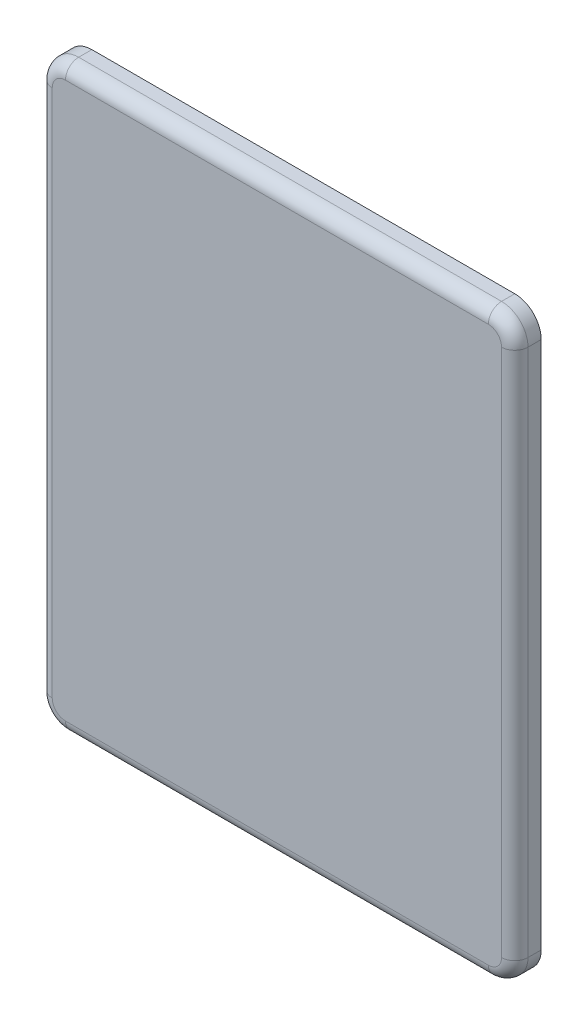
ISO-10303-21;
HEADER;
FILE_DESCRIPTION(('STEP AP214'),'2;1');
FILE_NAME('part.step','',(''),(''),'','','');
FILE_SCHEMA(('AUTOMOTIVE_DESIGN { 1 0 10303 214 1 1 1 1 }'));
ENDSEC;
DATA;
#1=APPLICATION_CONTEXT('core data for automotive mechanical design processes');
#2=APPLICATION_PROTOCOL_DEFINITION('international standard','automotive_design',2000,#1);
#3=PRODUCT_CONTEXT('',#1,'mechanical');
#4=PRODUCT('Part','Part','',(#3));
#5=PRODUCT_RELATED_PRODUCT_CATEGORY('part','',(#4));
#6=PRODUCT_DEFINITION_FORMATION('','',#4);
#7=PRODUCT_DEFINITION_CONTEXT('part definition',#1,'design');
#8=PRODUCT_DEFINITION('design','',#6,#7);
#9=PRODUCT_DEFINITION_SHAPE('','',#8);
#10=(LENGTH_UNIT() NAMED_UNIT(*) SI_UNIT(.MILLI.,.METRE.));
#11=(NAMED_UNIT(*) PLANE_ANGLE_UNIT() SI_UNIT($,.RADIAN.));
#12=(NAMED_UNIT(*) SI_UNIT($,.STERADIAN.) SOLID_ANGLE_UNIT());
#13=UNCERTAINTY_MEASURE_WITH_UNIT(LENGTH_MEASURE(1.E-05),#10,'distance_accuracy_value','');
#14=(GEOMETRIC_REPRESENTATION_CONTEXT(3) GLOBAL_UNCERTAINTY_ASSIGNED_CONTEXT((#13)) GLOBAL_UNIT_ASSIGNED_CONTEXT((#10,
#11,#12)) REPRESENTATION_CONTEXT('',''));
#15=CARTESIAN_POINT('',(0.,0.,0.));
#16=DIRECTION('',(0.,0.,1.));
#17=DIRECTION('',(1.,0.,0.));
#18=AXIS2_PLACEMENT_3D('',#15,#16,#17);
#19=CARTESIAN_POINT('',(13.49999934,11.49999934,0.5));
#20=DIRECTION('',(0.,0.,1.));
#21=DIRECTION('',(1.,0.,0.));
#22=AXIS2_PLACEMENT_3D('',#19,#20,#21);
#23=PLANE('',#22);
#24=CARTESIAN_POINT('',(13.899999361847,10.999999357519,0.5));
#25=DIRECTION('',(0.,0.,1.));
#26=DIRECTION('',(1.,0.,0.));
#27=AXIS2_PLACEMENT_3D('',#24,#25,#26);
#28=CIRCLE('',#27,0.0250000000000042);
#29=CARTESIAN_POINT('',(13.8999993629399,10.974999357519,0.5));
#30=VERTEX_POINT('',#29);
#31=CARTESIAN_POINT('',(13.9249993618472,10.9999993586119,0.5));
#32=VERTEX_POINT('',#31);
#33=EDGE_CURVE('E112',#30,#32,#28,.T.);
#34=ORIENTED_EDGE('',*,*,#33,.T.);
#35=DIRECTION('',(-4.371138828674E-08,0.999999999999999,0.));
#36=VECTOR('',#35,1.);
#37=CARTESIAN_POINT('',(13.9249993509195,11.249999358595,0.5));
#38=LINE('',#37,#36);
#39=CARTESIAN_POINT('',(13.924999318136,11.9999993585419,0.5));
#40=VERTEX_POINT('',#39);
#41=EDGE_CURVE('E128',#40,#32,#38,.F.);
#42=ORIENTED_EDGE('',*,*,#41,.F.);
#43=CARTESIAN_POINT('',(13.899999318135,11.999999357449,0.5));
#44=DIRECTION('',(0.,0.,1.));
#45=DIRECTION('',(1.,0.,0.));
#46=AXIS2_PLACEMENT_3D('',#43,#44,#45);
#47=CIRCLE('',#46,0.0250000000010017);
#48=CARTESIAN_POINT('',(13.8999993170426,12.0249993574501,0.5));
#49=VERTEX_POINT('',#48);
#50=EDGE_CURVE('E147',#40,#49,#47,.T.);
#51=ORIENTED_EDGE('',*,*,#50,.T.);
#52=DIRECTION('',(-0.999999999999999,-4.371138828674E-08,0.));
#53=VECTOR('',#52,1.);
#54=CARTESIAN_POINT('',(13.699999317047,12.0249993487078,0.5));
#55=LINE('',#54,#53);
#56=CARTESIAN_POINT('',(13.0999993170601,12.024999322481,0.5));
#57=VERTEX_POINT('',#56);
#58=EDGE_CURVE('E124',#57,#49,#55,.F.);
#59=ORIENTED_EDGE('',*,*,#58,.F.);
#60=CARTESIAN_POINT('',(13.099999318153,11.999999322481,0.5));
#61=DIRECTION('',(0.,0.,1.));
#62=DIRECTION('',(1.,0.,0.));
#63=AXIS2_PLACEMENT_3D('',#60,#61,#62);
#64=CIRCLE('',#63,0.0250000000000007);
#65=CARTESIAN_POINT('',(13.0749993181528,11.9999993213881,0.5));
#66=VERTEX_POINT('',#65);
#67=EDGE_CURVE('E143',#57,#66,#64,.T.);
#68=ORIENTED_EDGE('',*,*,#67,.T.);
#69=DIRECTION('',(4.371138821735E-08,-0.999999999999999,0.));
#70=VECTOR('',#69,1.);
#71=CARTESIAN_POINT('',(13.0749993290805,11.749999321405,0.5));
#72=LINE('',#71,#70);
#73=CARTESIAN_POINT('',(13.074999361864,10.9999993214581,0.5));
#74=VERTEX_POINT('',#73);
#75=EDGE_CURVE('E84',#74,#66,#72,.F.);
#76=ORIENTED_EDGE('',*,*,#75,.F.);
#77=CARTESIAN_POINT('',(13.099999361865,10.999999322551,0.5));
#78=DIRECTION('',(0.,0.,1.));
#79=DIRECTION('',(1.,0.,0.));
#80=AXIS2_PLACEMENT_3D('',#77,#78,#79);
#81=CIRCLE('',#80,0.0250000000009999);
#82=CARTESIAN_POINT('',(13.0999993629574,10.9749993225499,0.5));
#83=VERTEX_POINT('',#82);
#84=EDGE_CURVE('E21',#74,#83,#81,.T.);
#85=ORIENTED_EDGE('',*,*,#84,.T.);
#86=DIRECTION('',(0.999999999999999,4.371138828674E-08,0.));
#87=VECTOR('',#86,1.);
#88=CARTESIAN_POINT('',(13.299999362953,10.9749993312922,0.5));
#89=LINE('',#88,#87);
#90=EDGE_CURVE('E90',#30,#83,#89,.F.);
#91=ORIENTED_EDGE('',*,*,#90,.F.);
#92=EDGE_LOOP('',(#34,#42,#51,#59,#68,#76,#85,#91));
#93=FACE_BOUND('',#92,.T.);
#94=ADVANCED_FACE('F17',(#93),#23,.T.);
#95=CARTESIAN_POINT('',(13.074999329081,11.749999321405,0.475));
#96=DIRECTION('',(4.371138821735E-08,-0.999999999999999,0.));
#97=DIRECTION('',(0.999999999999999,4.371138821735E-08,0.));
#98=AXIS2_PLACEMENT_3D('',#95,#96,#97);
#99=CYLINDRICAL_SURFACE('',#98,0.025);
#100=CARTESIAN_POINT('',(13.074999318153,11.999999321388,0.474999999999998));
#101=DIRECTION('',(4.37200275982281E-08,-0.999999999999999,0.));
#102=DIRECTION('',(-0.999999999999999,-4.37200275982251E-08,0.));
#103=AXIS2_PLACEMENT_3D('',#100,#101,#102);
#104=CIRCLE('',#103,0.025000000000002);
#105=CARTESIAN_POINT('',(13.049999318153,11.999999320295,0.475));
#106=VERTEX_POINT('',#105);
#107=EDGE_CURVE('E145',#66,#106,#104,.T.);
#108=ORIENTED_EDGE('',*,*,#107,.T.);
#109=DIRECTION('',(4.371138821735E-08,-0.999999999999999,0.));
#110=VECTOR('',#109,1.);
#111=CARTESIAN_POINT('',(13.049999318153,11.999999320295,0.475));
#112=LINE('',#111,#110);
#113=CARTESIAN_POINT('',(13.0499993618641,10.999999320365,0.475));
#114=VERTEX_POINT('',#113);
#115=EDGE_CURVE('E177',#114,#106,#112,.F.);
#116=ORIENTED_EDGE('',*,*,#115,.F.);
#117=CARTESIAN_POINT('',(13.074999361864,10.999999321458,0.475));
#118=DIRECTION('',(-4.37200275982251E-08,0.999999999999999,0.));
#119=DIRECTION('',(-0.999999999999999,-4.37200275982251E-08,0.));
#120=AXIS2_PLACEMENT_3D('',#117,#118,#119);
#121=CIRCLE('',#120,0.0250000000000014);
#122=EDGE_CURVE('E105',#114,#74,#121,.T.);
#123=ORIENTED_EDGE('',*,*,#122,.T.);
#124=ORIENTED_EDGE('',*,*,#75,.T.);
#125=EDGE_LOOP('',(#108,#116,#123,#124));
#126=FACE_BOUND('',#125,.T.);
#127=ADVANCED_FACE('F287',(#126),#99,.T.);
#128=CARTESIAN_POINT('',(13.099999361865,10.999999322551,0.475));
#129=DIRECTION('',(0.,0.,1.));
#130=DIRECTION('',(1.,0.,0.));
#131=AXIS2_PLACEMENT_3D('',#128,#129,#130);
#132=TOROIDAL_SURFACE('',#131,0.0250000000009999,0.0250000000000014);
#133=ORIENTED_EDGE('',*,*,#84,.F.);
#134=ORIENTED_EDGE('',*,*,#122,.F.);
#135=CARTESIAN_POINT('',(13.099999361864,10.99999932255,0.475));
#136=DIRECTION('',(0.,0.,1.));
#137=DIRECTION('',(1.,0.,0.));
#138=AXIS2_PLACEMENT_3D('',#135,#136,#137);
#139=CIRCLE('',#138,0.05);
#140=CARTESIAN_POINT('',(13.0999993640499,10.9499993225502,0.475));
#141=VERTEX_POINT('',#140);
#142=EDGE_CURVE('E109',#141,#114,#139,.F.);
#143=ORIENTED_EDGE('',*,*,#142,.F.);
#144=CARTESIAN_POINT('',(13.099999362957,10.9749993225507,0.475));
#145=DIRECTION('',(0.999999999999999,4.371138828674E-08,0.));
#146=DIRECTION('',(-4.371138828674E-08,0.999999999999999,0.));
#147=AXIS2_PLACEMENT_3D('',#144,#145,#146);
#148=CIRCLE('',#147,0.025);
#149=EDGE_CURVE('E95',#83,#141,#148,.T.);
#150=ORIENTED_EDGE('',*,*,#149,.F.);
#151=EDGE_LOOP('',(#133,#134,#143,#150));
#152=FACE_BOUND('',#151,.T.);
#153=ADVANCED_FACE('F107',(#152),#132,.T.);
#154=CARTESIAN_POINT('',(13.299999362953,10.974999331293,0.475));
#155=DIRECTION('',(0.999999999999999,4.371138828674E-08,0.));
#156=DIRECTION('',(-4.371138828674E-08,0.999999999999999,0.));
#157=AXIS2_PLACEMENT_3D('',#154,#155,#156);
#158=CYLINDRICAL_SURFACE('',#157,0.025);
#159=ORIENTED_EDGE('',*,*,#149,.T.);
#160=DIRECTION('',(0.999999999999999,4.371138828674E-08,0.));
#161=VECTOR('',#160,1.);
#162=CARTESIAN_POINT('',(13.09999936405,10.94999932255,0.475));
#163=LINE('',#162,#161);
#164=CARTESIAN_POINT('',(13.899999364033,10.949999357519,0.475));
#165=VERTEX_POINT('',#164);
#166=EDGE_CURVE('E170',#165,#141,#163,.F.);
#167=ORIENTED_EDGE('',*,*,#166,.F.);
#168=CARTESIAN_POINT('',(13.89999936294,10.974999357519,0.474999999999998));
#169=DIRECTION('',(-0.999999999999999,-4.37200275982281E-08,0.));
#170=DIRECTION('',(4.37200275982251E-08,-0.999999999999999,0.));
#171=AXIS2_PLACEMENT_3D('',#168,#169,#170);
#172=CIRCLE('',#171,0.0250000000000024);
#173=EDGE_CURVE('E98',#165,#30,#172,.T.);
#174=ORIENTED_EDGE('',*,*,#173,.T.);
#175=ORIENTED_EDGE('',*,*,#90,.T.);
#176=EDGE_LOOP('',(#159,#167,#174,#175));
#177=FACE_BOUND('',#176,.T.);
#178=ADVANCED_FACE('F91',(#177),#158,.T.);
#179=CARTESIAN_POINT('',(13.899999361847,10.999999357519,0.474999999999998));
#180=DIRECTION('',(0.,0.,1.));
#181=DIRECTION('',(1.,0.,0.));
#182=AXIS2_PLACEMENT_3D('',#179,#180,#181);
#183=TOROIDAL_SURFACE('',#182,0.0250000000000042,0.0250000000000024);
#184=ORIENTED_EDGE('',*,*,#33,.F.);
#185=ORIENTED_EDGE('',*,*,#173,.F.);
#186=CARTESIAN_POINT('',(13.899999361847,10.999999357519,0.475));
#187=DIRECTION('',(0.,0.,1.));
#188=DIRECTION('',(1.,0.,0.));
#189=AXIS2_PLACEMENT_3D('',#186,#187,#188);
#190=CIRCLE('',#189,0.05);
#191=CARTESIAN_POINT('',(13.949999361847,10.9999993597049,0.475));
#192=VERTEX_POINT('',#191);
#193=EDGE_CURVE('E158',#192,#165,#190,.F.);
#194=ORIENTED_EDGE('',*,*,#193,.F.);
#195=CARTESIAN_POINT('',(13.9249993618468,10.999999358612,0.475));
#196=DIRECTION('',(-4.371138828674E-08,0.999999999999999,0.));
#197=DIRECTION('',(-0.999999999999999,-4.371138828674E-08,0.));
#198=AXIS2_PLACEMENT_3D('',#195,#196,#197);
#199=CIRCLE('',#198,0.025);
#200=EDGE_CURVE('E129',#32,#192,#199,.T.);
#201=ORIENTED_EDGE('',*,*,#200,.F.);
#202=EDGE_LOOP('',(#184,#185,#194,#201));
#203=FACE_BOUND('',#202,.T.);
#204=ADVANCED_FACE('F155',(#203),#183,.T.);
#205=CARTESIAN_POINT('',(13.924999350919,11.249999358595,0.475));
#206=DIRECTION('',(-4.371138828674E-08,0.999999999999999,0.));
#207=DIRECTION('',(-0.999999999999999,-4.371138828674E-08,0.));
#208=AXIS2_PLACEMENT_3D('',#205,#206,#207);
#209=CYLINDRICAL_SURFACE('',#208,0.025);
#210=ORIENTED_EDGE('',*,*,#200,.T.);
#211=DIRECTION('',(-4.371138828674E-08,0.999999999999999,0.));
#212=VECTOR('',#211,1.);
#213=CARTESIAN_POINT('',(13.949999361847,10.999999359705,0.475));
#214=LINE('',#213,#212);
#215=CARTESIAN_POINT('',(13.9499993181359,11.9999993579962,0.475));
#216=VERTEX_POINT('',#215);
#217=EDGE_CURVE('E221',#216,#192,#214,.F.);
#218=ORIENTED_EDGE('',*,*,#217,.F.);
#219=CARTESIAN_POINT('',(13.924999318136,11.999999358542,0.475));
#220=DIRECTION('',(4.37199582092891E-08,-0.999999999999999,0.));
#221=DIRECTION('',(0.999999999999999,4.37199582092891E-08,0.));
#222=AXIS2_PLACEMENT_3D('',#219,#220,#221);
#223=CIRCLE('',#222,0.0250000000000004);
#224=EDGE_CURVE('E127',#216,#40,#223,.T.);
#225=ORIENTED_EDGE('',*,*,#224,.T.);
#226=ORIENTED_EDGE('',*,*,#41,.T.);
#227=EDGE_LOOP('',(#210,#218,#225,#226));
#228=FACE_BOUND('',#227,.T.);
#229=ADVANCED_FACE('F397',(#228),#209,.T.);
#230=CARTESIAN_POINT('',(13.899999318135,11.999999357449,0.475));
#231=DIRECTION('',(0.,0.,1.));
#232=DIRECTION('',(1.,0.,0.));
#233=AXIS2_PLACEMENT_3D('',#230,#231,#232);
#234=TOROIDAL_SURFACE('',#233,0.0250000000010017,0.0250000000000004);
#235=CARTESIAN_POINT('',(13.899999318136,11.99999935745,0.475));
#236=DIRECTION('',(0.,0.,1.));
#237=DIRECTION('',(1.,0.,0.));
#238=AXIS2_PLACEMENT_3D('',#235,#236,#237);
#239=CIRCLE('',#238,0.05);
#240=CARTESIAN_POINT('',(13.8999993159501,12.0499993574498,0.475));
#241=VERTEX_POINT('',#240);
#242=EDGE_CURVE('E211',#241,#216,#239,.F.);
#243=ORIENTED_EDGE('',*,*,#242,.F.);
#244=CARTESIAN_POINT('',(13.899999317043,12.0249993574493,0.475));
#245=DIRECTION('',(-0.999999999999999,-4.371138828674E-08,0.));
#246=DIRECTION('',(4.371138828674E-08,-0.999999999999999,0.));
#247=AXIS2_PLACEMENT_3D('',#244,#245,#246);
#248=CIRCLE('',#247,0.025);
#249=EDGE_CURVE('E126',#49,#241,#248,.T.);
#250=ORIENTED_EDGE('',*,*,#249,.F.);
#251=ORIENTED_EDGE('',*,*,#50,.F.);
#252=ORIENTED_EDGE('',*,*,#224,.F.);
#253=EDGE_LOOP('',(#243,#250,#251,#252));
#254=FACE_BOUND('',#253,.T.);
#255=ADVANCED_FACE('F388',(#254),#234,.T.);
#256=CARTESIAN_POINT('',(13.699999317047,12.024999348707,0.475));
#257=DIRECTION('',(-0.999999999999999,-4.371138828674E-08,0.));
#258=DIRECTION('',(4.371138828674E-08,-0.999999999999999,0.));
#259=AXIS2_PLACEMENT_3D('',#256,#257,#258);
#260=CYLINDRICAL_SURFACE('',#259,0.025);
#261=ORIENTED_EDGE('',*,*,#249,.T.);
#262=DIRECTION('',(-0.999999999999999,-4.371138828674E-08,0.));
#263=VECTOR('',#262,1.);
#264=CARTESIAN_POINT('',(13.89999931595,12.04999935745,0.475));
#265=LINE('',#264,#263);
#266=CARTESIAN_POINT('',(13.099999315967,12.049999322481,0.475));
#267=VERTEX_POINT('',#266);
#268=EDGE_CURVE('E199',#267,#241,#265,.F.);
#269=ORIENTED_EDGE('',*,*,#268,.F.);
#270=CARTESIAN_POINT('',(13.09999931706,12.024999322481,0.475));
#271=DIRECTION('',(0.999999999999999,4.37200275982251E-08,0.));
#272=DIRECTION('',(-4.37200275982251E-08,0.999999999999999,0.));
#273=AXIS2_PLACEMENT_3D('',#270,#271,#272);
#274=CIRCLE('',#273,0.0250000000000014);
#275=EDGE_CURVE('E146',#267,#57,#274,.T.);
#276=ORIENTED_EDGE('',*,*,#275,.T.);
#277=ORIENTED_EDGE('',*,*,#58,.T.);
#278=EDGE_LOOP('',(#261,#269,#276,#277));
#279=FACE_BOUND('',#278,.T.);
#280=ADVANCED_FACE('F380',(#279),#260,.T.);
#281=CARTESIAN_POINT('',(13.099999318153,11.999999322481,0.475));
#282=DIRECTION('',(0.,0.,1.));
#283=DIRECTION('',(1.,0.,0.));
#284=AXIS2_PLACEMENT_3D('',#281,#282,#283);
#285=DEGENERATE_TOROIDAL_SURFACE('',#284,0.0250000000000007,0.0250000000000014,.T.);
#286=ORIENTED_EDGE('',*,*,#67,.F.);
#287=ORIENTED_EDGE('',*,*,#275,.F.);
#288=CARTESIAN_POINT('',(13.099999318153,11.999999322481,0.475));
#289=DIRECTION('',(0.,0.,1.));
#290=DIRECTION('',(1.,0.,0.));
#291=AXIS2_PLACEMENT_3D('',#288,#289,#290);
#292=CIRCLE('',#291,0.05);
#293=EDGE_CURVE('E194',#106,#267,#292,.F.);
#294=ORIENTED_EDGE('',*,*,#293,.F.);
#295=ORIENTED_EDGE('',*,*,#107,.F.);
#296=EDGE_LOOP('',(#286,#287,#294,#295));
#297=FACE_BOUND('',#296,.T.);
#298=ADVANCED_FACE('F19',(#297),#285,.T.);
#299=CARTESIAN_POINT('',(13.049999318153,11.999999320295,0.45));
#300=DIRECTION('',(-0.999999999999999,-4.371138821735E-08,0.));
#301=DIRECTION('',(4.371138821735E-08,-0.999999999999999,0.));
#302=AXIS2_PLACEMENT_3D('',#299,#300,#301);
#303=PLANE('',#302);
#304=DIRECTION('',(0.,1.,0.));
#305=VECTOR('',#304,1.);
#306=CARTESIAN_POINT('',(13.049999318153,11.49999934,0.45));
#307=LINE('',#306,#305);
#308=CARTESIAN_POINT('',(13.049999318153,11.999999321388,0.45));
#309=VERTEX_POINT('',#308);
#310=CARTESIAN_POINT('',(13.0499993400085,10.9999993214575,0.45));
#311=VERTEX_POINT('',#310);
#312=EDGE_CURVE('E142',#309,#311,#307,.F.);
#313=ORIENTED_EDGE('',*,*,#312,.T.);
#314=DIRECTION('',(0.,0.,1.));
#315=VECTOR('',#314,1.);
#316=CARTESIAN_POINT('',(13.049999361864,10.999999320365,0.45));
#317=LINE('',#316,#315);
#318=EDGE_CURVE('E173',#114,#311,#317,.F.);
#319=ORIENTED_EDGE('',*,*,#318,.F.);
#320=ORIENTED_EDGE('',*,*,#115,.T.);
#321=DIRECTION('',(0.,0.,1.));
#322=VECTOR('',#321,1.);
#323=CARTESIAN_POINT('',(13.049999318153,11.999999320295,0.45));
#324=LINE('',#323,#322);
#325=EDGE_CURVE('E251',#309,#106,#324,.T.);
#326=ORIENTED_EDGE('',*,*,#325,.F.);
#327=EDGE_LOOP('',(#313,#319,#320,#326));
#328=FACE_BOUND('',#327,.T.);
#329=ADVANCED_FACE('F289',(#328),#303,.T.);
#330=CARTESIAN_POINT('',(13.099999361864,10.99999932255,0.45));
#331=DIRECTION('',(0.,0.,1.));
#332=DIRECTION('',(1.,0.,0.));
#333=AXIS2_PLACEMENT_3D('',#330,#331,#332);
#334=CYLINDRICAL_SURFACE('',#333,0.05);
#335=CARTESIAN_POINT('',(13.099999361864,10.99999932255,0.45));
#336=DIRECTION('',(0.,0.,1.));
#337=DIRECTION('',(1.,0.,0.));
#338=AXIS2_PLACEMENT_3D('',#335,#336,#337);
#339=CIRCLE('',#338,0.05);
#340=CARTESIAN_POINT('',(13.099999362957,10.94999932255,0.45));
#341=VERTEX_POINT('',#340);
#342=EDGE_CURVE('E139',#311,#341,#339,.T.);
#343=ORIENTED_EDGE('',*,*,#342,.T.);
#344=DIRECTION('',(0.,0.,1.));
#345=VECTOR('',#344,1.);
#346=CARTESIAN_POINT('',(13.09999936405,10.94999932255,0.45));
#347=LINE('',#346,#345);
#348=EDGE_CURVE('E172',#141,#341,#347,.F.);
#349=ORIENTED_EDGE('',*,*,#348,.F.);
#350=ORIENTED_EDGE('',*,*,#142,.T.);
#351=ORIENTED_EDGE('',*,*,#318,.T.);
#352=EDGE_LOOP('',(#343,#349,#350,#351));
#353=FACE_BOUND('',#352,.T.);
#354=ADVANCED_FACE('F291',(#353),#334,.T.);
#355=CARTESIAN_POINT('',(13.09999936405,10.94999932255,0.45));
#356=DIRECTION('',(4.371138828674E-08,-0.999999999999999,0.));
#357=DIRECTION('',(0.999999999999999,4.371138828674E-08,0.));
#358=AXIS2_PLACEMENT_3D('',#355,#356,#357);
#359=PLANE('',#358);
#360=DIRECTION('',(1.,0.,0.));
#361=VECTOR('',#360,1.);
#362=CARTESIAN_POINT('',(13.49999934,10.94999932255,0.45));
#363=LINE('',#362,#361);
#364=CARTESIAN_POINT('',(13.89999936294,10.9499993400345,0.45));
#365=VERTEX_POINT('',#364);
#366=EDGE_CURVE('E138',#341,#365,#363,.T.);
#367=ORIENTED_EDGE('',*,*,#366,.T.);
#368=DIRECTION('',(0.,0.,1.));
#369=VECTOR('',#368,1.);
#370=CARTESIAN_POINT('',(13.899999364033,10.949999357519,0.45));
#371=LINE('',#370,#369);
#372=EDGE_CURVE('E223',#165,#365,#371,.F.);
#373=ORIENTED_EDGE('',*,*,#372,.F.);
#374=ORIENTED_EDGE('',*,*,#166,.T.);
#375=ORIENTED_EDGE('',*,*,#348,.T.);
#376=EDGE_LOOP('',(#367,#373,#374,#375));
#377=FACE_BOUND('',#376,.T.);
#378=ADVANCED_FACE('F294',(#377),#359,.T.);
#379=CARTESIAN_POINT('',(13.899999361847,10.999999357519,0.45));
#380=DIRECTION('',(0.,0.,1.));
#381=DIRECTION('',(1.,0.,0.));
#382=AXIS2_PLACEMENT_3D('',#379,#380,#381);
#383=CYLINDRICAL_SURFACE('',#382,0.05);
#384=CARTESIAN_POINT('',(13.899999361847,10.999999357519,0.45));
#385=DIRECTION('',(0.,0.,1.));
#386=DIRECTION('',(1.,0.,0.));
#387=AXIS2_PLACEMENT_3D('',#384,#385,#386);
#388=CIRCLE('',#387,0.05);
#389=CARTESIAN_POINT('',(13.949999361847,10.999999358612,0.45));
#390=VERTEX_POINT('',#389);
#391=EDGE_CURVE('E135',#365,#390,#388,.T.);
#392=ORIENTED_EDGE('',*,*,#391,.T.);
#393=DIRECTION('',(0.,0.,1.));
#394=VECTOR('',#393,1.);
#395=CARTESIAN_POINT('',(13.949999361847,10.999999359705,0.45));
#396=LINE('',#395,#394);
#397=EDGE_CURVE('E214',#192,#390,#396,.F.);
#398=ORIENTED_EDGE('',*,*,#397,.F.);
#399=ORIENTED_EDGE('',*,*,#193,.T.);
#400=ORIENTED_EDGE('',*,*,#372,.T.);
#401=EDGE_LOOP('',(#392,#398,#399,#400));
#402=FACE_BOUND('',#401,.T.);
#403=ADVANCED_FACE('F295',(#402),#383,.T.);
#404=CARTESIAN_POINT('',(13.949999361847,10.999999359705,0.45));
#405=DIRECTION('',(0.999999999999999,4.371138828674E-08,0.));
#406=DIRECTION('',(-4.371138828674E-08,0.999999999999999,0.));
#407=AXIS2_PLACEMENT_3D('',#404,#405,#406);
#408=PLANE('',#407);
#409=DIRECTION('',(0.,1.,0.));
#410=VECTOR('',#409,1.);
#411=CARTESIAN_POINT('',(13.949999361847,11.49999934,0.45));
#412=LINE('',#411,#410);
#413=CARTESIAN_POINT('',(13.9499993399915,11.99999935745,0.45));
#414=VERTEX_POINT('',#413);
#415=EDGE_CURVE('E134',#390,#414,#412,.T.);
#416=ORIENTED_EDGE('',*,*,#415,.T.);
#417=DIRECTION('',(0.,0.,1.));
#418=VECTOR('',#417,1.);
#419=CARTESIAN_POINT('',(13.949999318136,11.99999935745,0.45));
#420=LINE('',#419,#418);
#421=EDGE_CURVE('E202',#216,#414,#420,.F.);
#422=ORIENTED_EDGE('',*,*,#421,.F.);
#423=ORIENTED_EDGE('',*,*,#217,.T.);
#424=ORIENTED_EDGE('',*,*,#397,.T.);
#425=EDGE_LOOP('',(#416,#422,#423,#424));
#426=FACE_BOUND('',#425,.T.);
#427=ADVANCED_FACE('F278',(#426),#408,.T.);
#428=CARTESIAN_POINT('',(13.899999318136,11.99999935745,0.45));
#429=DIRECTION('',(0.,0.,1.));
#430=DIRECTION('',(1.,0.,0.));
#431=AXIS2_PLACEMENT_3D('',#428,#429,#430);
#432=CYLINDRICAL_SURFACE('',#431,0.05);
#433=CARTESIAN_POINT('',(13.899999318136,11.99999935745,0.45));
#434=DIRECTION('',(0.,0.,1.));
#435=DIRECTION('',(1.,0.,0.));
#436=AXIS2_PLACEMENT_3D('',#433,#434,#435);
#437=CIRCLE('',#436,0.05);
#438=CARTESIAN_POINT('',(13.899999317043,12.04999935745,0.45));
#439=VERTEX_POINT('',#438);
#440=EDGE_CURVE('E131',#414,#439,#437,.T.);
#441=ORIENTED_EDGE('',*,*,#440,.T.);
#442=DIRECTION('',(0.,0.,1.));
#443=VECTOR('',#442,1.);
#444=CARTESIAN_POINT('',(13.89999931595,12.04999935745,0.45));
#445=LINE('',#444,#443);
#446=EDGE_CURVE('E196',#241,#439,#445,.F.);
#447=ORIENTED_EDGE('',*,*,#446,.F.);
#448=ORIENTED_EDGE('',*,*,#242,.T.);
#449=ORIENTED_EDGE('',*,*,#421,.T.);
#450=EDGE_LOOP('',(#441,#447,#448,#449));
#451=FACE_BOUND('',#450,.T.);
#452=ADVANCED_FACE('F272',(#451),#432,.T.);
#453=CARTESIAN_POINT('',(13.89999931595,12.04999935745,0.45));
#454=DIRECTION('',(-4.371138828674E-08,0.999999999999999,0.));
#455=DIRECTION('',(-0.999999999999999,-4.371138828674E-08,0.));
#456=AXIS2_PLACEMENT_3D('',#453,#454,#455);
#457=PLANE('',#456);
#458=DIRECTION('',(1.,0.,0.));
#459=VECTOR('',#458,1.);
#460=CARTESIAN_POINT('',(13.49999934,12.04999935745,0.45));
#461=LINE('',#460,#459);
#462=CARTESIAN_POINT('',(13.09999931706,12.0499993399655,0.45));
#463=VERTEX_POINT('',#462);
#464=EDGE_CURVE('E27',#439,#463,#461,.F.);
#465=ORIENTED_EDGE('',*,*,#464,.T.);
#466=DIRECTION('',(0.,0.,1.));
#467=VECTOR('',#466,1.);
#468=CARTESIAN_POINT('',(13.099999315967,12.049999322481,0.45));
#469=LINE('',#468,#467);
#470=EDGE_CURVE('E35',#267,#463,#469,.F.);
#471=ORIENTED_EDGE('',*,*,#470,.F.);
#472=ORIENTED_EDGE('',*,*,#268,.T.);
#473=ORIENTED_EDGE('',*,*,#446,.T.);
#474=EDGE_LOOP('',(#465,#471,#472,#473));
#475=FACE_BOUND('',#474,.T.);
#476=ADVANCED_FACE('F265',(#475),#457,.T.);
#477=CARTESIAN_POINT('',(13.099999318153,11.999999322481,0.45));
#478=DIRECTION('',(0.,0.,1.));
#479=DIRECTION('',(1.,0.,0.));
#480=AXIS2_PLACEMENT_3D('',#477,#478,#479);
#481=CYLINDRICAL_SURFACE('',#480,0.05);
#482=CARTESIAN_POINT('',(13.099999318153,11.999999322481,0.45));
#483=DIRECTION('',(0.,0.,1.));
#484=DIRECTION('',(1.,0.,0.));
#485=AXIS2_PLACEMENT_3D('',#482,#483,#484);
#486=CIRCLE('',#485,0.05);
#487=EDGE_CURVE('E11',#463,#309,#486,.T.);
#488=ORIENTED_EDGE('',*,*,#487,.T.);
#489=ORIENTED_EDGE('',*,*,#325,.T.);
#490=ORIENTED_EDGE('',*,*,#293,.T.);
#491=ORIENTED_EDGE('',*,*,#470,.T.);
#492=EDGE_LOOP('',(#488,#489,#490,#491));
#493=FACE_BOUND('',#492,.T.);
#494=ADVANCED_FACE('F306',(#493),#481,.T.);
#495=CARTESIAN_POINT('',(13.49999934,11.49999934,0.45));
#496=DIRECTION('',(0.,0.,1.));
#497=DIRECTION('',(1.,0.,0.));
#498=AXIS2_PLACEMENT_3D('',#495,#496,#497);
#499=PLANE('',#498);
#500=ORIENTED_EDGE('',*,*,#464,.F.);
#501=ORIENTED_EDGE('',*,*,#440,.F.);
#502=ORIENTED_EDGE('',*,*,#415,.F.);
#503=ORIENTED_EDGE('',*,*,#391,.F.);
#504=ORIENTED_EDGE('',*,*,#366,.F.);
#505=ORIENTED_EDGE('',*,*,#342,.F.);
#506=ORIENTED_EDGE('',*,*,#312,.F.);
#507=ORIENTED_EDGE('',*,*,#487,.F.);
#508=EDGE_LOOP('',(#500,#501,#502,#503,#504,#505,#506,#507));
#509=FACE_BOUND('',#508,.T.);
#510=ADVANCED_FACE('F269',(#509),#499,.F.);
#511=CLOSED_SHELL('',(#94,#127,#153,#178,#204,#229,#255,#280,#298,#329,#354,#378,#403,#427,#452,
#476,#494,#510));
#512=MANIFOLD_SOLID_BREP('B1',#511);
#513=ADVANCED_BREP_SHAPE_REPRESENTATION('',(#18,#512),#14);
#514=SHAPE_DEFINITION_REPRESENTATION(#9,#513);
ENDSEC;
END-ISO-10303-21;
